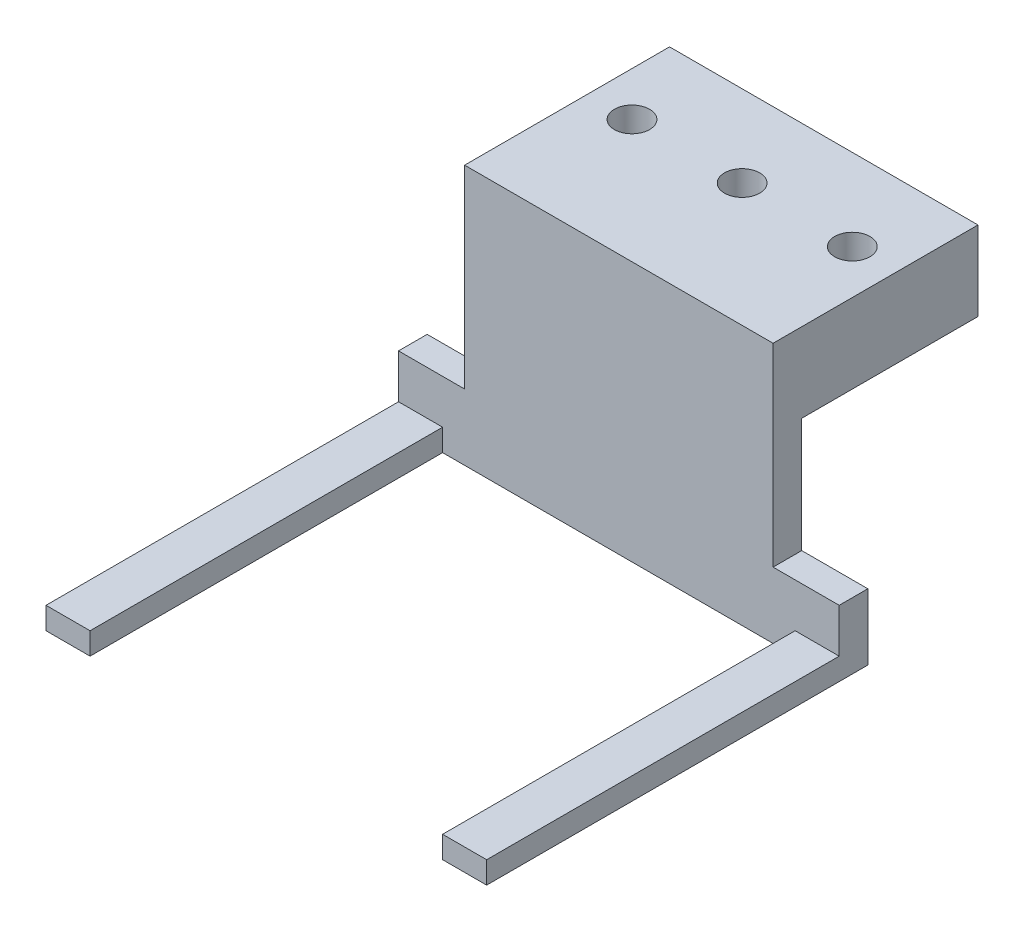
ISO-10303-21;
HEADER;
FILE_DESCRIPTION(('STEP AP214'),'2;1');
FILE_NAME('part.step','',(''),(''),'','','');
FILE_SCHEMA(('AUTOMOTIVE_DESIGN { 1 0 10303 214 1 1 1 1 }'));
ENDSEC;
DATA;
#1=APPLICATION_CONTEXT('core data for automotive mechanical design processes');
#2=APPLICATION_PROTOCOL_DEFINITION('international standard','automotive_design',2000,#1);
#3=PRODUCT_CONTEXT('',#1,'mechanical');
#4=PRODUCT('Part','Part','',(#3));
#5=PRODUCT_RELATED_PRODUCT_CATEGORY('part','',(#4));
#6=PRODUCT_DEFINITION_FORMATION('','',#4);
#7=PRODUCT_DEFINITION_CONTEXT('part definition',#1,'design');
#8=PRODUCT_DEFINITION('design','',#6,#7);
#9=PRODUCT_DEFINITION_SHAPE('','',#8);
#10=(LENGTH_UNIT() NAMED_UNIT(*) SI_UNIT(.MILLI.,.METRE.));
#11=(NAMED_UNIT(*) PLANE_ANGLE_UNIT() SI_UNIT($,.RADIAN.));
#12=(NAMED_UNIT(*) SI_UNIT($,.STERADIAN.) SOLID_ANGLE_UNIT());
#13=UNCERTAINTY_MEASURE_WITH_UNIT(LENGTH_MEASURE(1.E-05),#10,'distance_accuracy_value','');
#14=(GEOMETRIC_REPRESENTATION_CONTEXT(3) GLOBAL_UNCERTAINTY_ASSIGNED_CONTEXT((#13)) GLOBAL_UNIT_ASSIGNED_CONTEXT((#10,
#11,#12)) REPRESENTATION_CONTEXT('',''));
#15=CARTESIAN_POINT('',(0.,0.,0.));
#16=DIRECTION('',(0.,0.,1.));
#17=DIRECTION('',(1.,0.,0.));
#18=AXIS2_PLACEMENT_3D('',#15,#16,#17);
#19=CARTESIAN_POINT('',(70.,18.,40.));
#20=DIRECTION('',(-1.,0.,0.));
#21=DIRECTION('',(0.,0.,1.));
#22=AXIS2_PLACEMENT_3D('',#19,#20,#21);
#23=PLANE('',#22);
#24=DIRECTION('',(0.,0.,1.));
#25=VECTOR('',#24,1.);
#26=CARTESIAN_POINT('',(70.,-26.,18.7867965644036));
#27=LINE('',#26,#25);
#28=CARTESIAN_POINT('',(70.,-26.,40.));
#29=VERTEX_POINT('',#28);
#30=CARTESIAN_POINT('',(70.,-26.,46.5));
#31=VERTEX_POINT('',#30);
#32=EDGE_CURVE('E213',#29,#31,#27,.T.);
#33=ORIENTED_EDGE('',*,*,#32,.F.);
#34=DIRECTION('',(0.,1.,0.));
#35=VECTOR('',#34,1.);
#36=CARTESIAN_POINT('',(70.,-41.,40.));
#37=LINE('',#36,#35);
#38=CARTESIAN_POINT('',(70.,0.,40.));
#39=VERTEX_POINT('',#38);
#40=EDGE_CURVE('E254',#29,#39,#37,.T.);
#41=ORIENTED_EDGE('',*,*,#40,.T.);
#42=DIRECTION('',(0.,0.,-1.));
#43=VECTOR('',#42,1.);
#44=CARTESIAN_POINT('',(70.,0.,40.));
#45=LINE('',#44,#43);
#46=CARTESIAN_POINT('',(70.,0.,0.));
#47=VERTEX_POINT('',#46);
#48=EDGE_CURVE('E266',#39,#47,#45,.T.);
#49=ORIENTED_EDGE('',*,*,#48,.T.);
#50=DIRECTION('',(0.,-1.,0.));
#51=VECTOR('',#50,1.);
#52=CARTESIAN_POINT('',(70.,18.,0.));
#53=LINE('',#52,#51);
#54=CARTESIAN_POINT('',(70.,18.,0.));
#55=VERTEX_POINT('',#54);
#56=EDGE_CURVE('E47',#55,#47,#53,.T.);
#57=ORIENTED_EDGE('',*,*,#56,.F.);
#58=DIRECTION('',(0.,0.,-1.));
#59=VECTOR('',#58,1.);
#60=CARTESIAN_POINT('',(70.,18.,40.));
#61=LINE('',#60,#59);
#62=CARTESIAN_POINT('',(70.,18.,46.5));
#63=VERTEX_POINT('',#62);
#64=EDGE_CURVE('E269',#63,#55,#61,.T.);
#65=ORIENTED_EDGE('',*,*,#64,.F.);
#66=DIRECTION('',(0.,1.,0.));
#67=VECTOR('',#66,1.);
#68=CARTESIAN_POINT('',(70.,-41.,46.5));
#69=LINE('',#68,#67);
#70=EDGE_CURVE('E257',#31,#63,#69,.T.);
#71=ORIENTED_EDGE('',*,*,#70,.F.);
#72=EDGE_LOOP('',(#33,#41,#49,#57,#65,#71));
#73=FACE_BOUND('',#72,.T.);
#74=ADVANCED_FACE('F39',(#73),#23,.F.);
#75=CARTESIAN_POINT('',(70.,18.,0.));
#76=DIRECTION('',(0.,0.,1.));
#77=DIRECTION('',(1.,0.,0.));
#78=AXIS2_PLACEMENT_3D('',#75,#76,#77);
#79=PLANE('',#78);
#80=DIRECTION('',(-1.,0.,0.));
#81=VECTOR('',#80,1.);
#82=CARTESIAN_POINT('',(70.,0.,0.));
#83=LINE('',#82,#81);
#84=CARTESIAN_POINT('',(0.,0.,0.));
#85=VERTEX_POINT('',#84);
#86=EDGE_CURVE('E256',#47,#85,#83,.T.);
#87=ORIENTED_EDGE('',*,*,#86,.T.);
#88=DIRECTION('',(0.,-1.,0.));
#89=VECTOR('',#88,1.);
#90=CARTESIAN_POINT('',(0.,18.,0.));
#91=LINE('',#90,#89);
#92=CARTESIAN_POINT('',(0.,18.,0.));
#93=VERTEX_POINT('',#92);
#94=EDGE_CURVE('E11',#93,#85,#91,.T.);
#95=ORIENTED_EDGE('',*,*,#94,.F.);
#96=DIRECTION('',(-1.,0.,0.));
#97=VECTOR('',#96,1.);
#98=CARTESIAN_POINT('',(70.,18.,0.));
#99=LINE('',#98,#97);
#100=EDGE_CURVE('E262',#55,#93,#99,.T.);
#101=ORIENTED_EDGE('',*,*,#100,.F.);
#102=ORIENTED_EDGE('',*,*,#56,.T.);
#103=EDGE_LOOP('',(#87,#95,#101,#102));
#104=FACE_BOUND('',#103,.T.);
#105=ADVANCED_FACE('F41',(#104),#79,.F.);
#106=CARTESIAN_POINT('',(0.,18.,0.));
#107=DIRECTION('',(1.,0.,0.));
#108=DIRECTION('',(0.,0.,-1.));
#109=AXIS2_PLACEMENT_3D('',#106,#107,#108);
#110=PLANE('',#109);
#111=DIRECTION('',(0.,1.,0.));
#112=VECTOR('',#111,1.);
#113=CARTESIAN_POINT('',(0.,-41.,40.));
#114=LINE('',#113,#112);
#115=CARTESIAN_POINT('',(0.,-26.,40.));
#116=VERTEX_POINT('',#115);
#117=CARTESIAN_POINT('',(0.,0.,40.));
#118=VERTEX_POINT('',#117);
#119=EDGE_CURVE('E251',#116,#118,#114,.T.);
#120=ORIENTED_EDGE('',*,*,#119,.F.);
#121=DIRECTION('',(0.,0.,1.));
#122=VECTOR('',#121,1.);
#123=CARTESIAN_POINT('',(0.,-26.,18.7867965644036));
#124=LINE('',#123,#122);
#125=CARTESIAN_POINT('',(0.,-26.,46.5));
#126=VERTEX_POINT('',#125);
#127=EDGE_CURVE('E242',#116,#126,#124,.T.);
#128=ORIENTED_EDGE('',*,*,#127,.T.);
#129=DIRECTION('',(0.,1.,0.));
#130=VECTOR('',#129,1.);
#131=CARTESIAN_POINT('',(0.,-41.,46.5));
#132=LINE('',#131,#130);
#133=CARTESIAN_POINT('',(0.,18.,46.5));
#134=VERTEX_POINT('',#133);
#135=EDGE_CURVE('E259',#126,#134,#132,.T.);
#136=ORIENTED_EDGE('',*,*,#135,.T.);
#137=DIRECTION('',(0.,0.,1.));
#138=VECTOR('',#137,1.);
#139=CARTESIAN_POINT('',(0.,18.,0.));
#140=LINE('',#139,#138);
#141=EDGE_CURVE('E265',#93,#134,#140,.T.);
#142=ORIENTED_EDGE('',*,*,#141,.F.);
#143=ORIENTED_EDGE('',*,*,#94,.T.);
#144=DIRECTION('',(0.,0.,1.));
#145=VECTOR('',#144,1.);
#146=CARTESIAN_POINT('',(0.,0.,0.));
#147=LINE('',#146,#145);
#148=EDGE_CURVE('E273',#85,#118,#147,.T.);
#149=ORIENTED_EDGE('',*,*,#148,.T.);
#150=EDGE_LOOP('',(#120,#128,#136,#142,#143,#149));
#151=FACE_BOUND('',#150,.T.);
#152=ADVANCED_FACE('F293',(#151),#110,.F.);
#153=CARTESIAN_POINT('',(0.,18.,0.));
#154=DIRECTION('',(0.,1.,0.));
#155=DIRECTION('',(0.,0.,1.));
#156=AXIS2_PLACEMENT_3D('',#153,#154,#155);
#157=PLANE('',#156);
#158=CARTESIAN_POINT('',(10.,18.,18.523));
#159=DIRECTION('',(0.,1.,0.));
#160=DIRECTION('',(0.,0.,-1.));
#161=AXIS2_PLACEMENT_3D('',#158,#159,#160);
#162=CIRCLE('',#161,4.00000000000001);
#163=CARTESIAN_POINT('',(10.,18.,14.523));
#164=VERTEX_POINT('',#163);
#165=EDGE_CURVE('E594',#164,#164,#162,.T.);
#166=ORIENTED_EDGE('',*,*,#165,.F.);
#167=EDGE_LOOP('',(#166));
#168=FACE_BOUND('',#167,.T.);
#169=CARTESIAN_POINT('',(60.,18.,18.523));
#170=DIRECTION('',(0.,1.,0.));
#171=DIRECTION('',(0.,0.,1.));
#172=AXIS2_PLACEMENT_3D('',#169,#170,#171);
#173=CIRCLE('',#172,4.00000000000001);
#174=CARTESIAN_POINT('',(60.,18.,22.523));
#175=VERTEX_POINT('',#174);
#176=EDGE_CURVE('E598',#175,#175,#173,.T.);
#177=ORIENTED_EDGE('',*,*,#176,.F.);
#178=EDGE_LOOP('',(#177));
#179=FACE_BOUND('',#178,.T.);
#180=CARTESIAN_POINT('',(35.,18.,18.523));
#181=DIRECTION('',(0.,1.,0.));
#182=DIRECTION('',(0.,0.,1.));
#183=AXIS2_PLACEMENT_3D('',#180,#181,#182);
#184=CIRCLE('',#183,4.00000000000001);
#185=CARTESIAN_POINT('',(35.,18.,22.523));
#186=VERTEX_POINT('',#185);
#187=EDGE_CURVE('E603',#186,#186,#184,.T.);
#188=ORIENTED_EDGE('',*,*,#187,.F.);
#189=EDGE_LOOP('',(#188));
#190=FACE_BOUND('',#189,.T.);
#191=ORIENTED_EDGE('',*,*,#100,.T.);
#192=ORIENTED_EDGE('',*,*,#141,.T.);
#193=DIRECTION('',(1.,0.,0.));
#194=VECTOR('',#193,1.);
#195=CARTESIAN_POINT('',(0.,18.,46.5));
#196=LINE('',#195,#194);
#197=EDGE_CURVE('E246',#134,#63,#196,.T.);
#198=ORIENTED_EDGE('',*,*,#197,.T.);
#199=ORIENTED_EDGE('',*,*,#64,.T.);
#200=EDGE_LOOP('',(#191,#192,#198,#199));
#201=FACE_BOUND('',#200,.T.);
#202=ADVANCED_FACE('F297',(#168,#179,#190,#201),#157,.T.);
#203=CARTESIAN_POINT('',(0.,0.,0.));
#204=DIRECTION('',(0.,1.,0.));
#205=DIRECTION('',(0.,0.,1.));
#206=AXIS2_PLACEMENT_3D('',#203,#204,#205);
#207=PLANE('',#206);
#208=CARTESIAN_POINT('',(10.,0.,18.523));
#209=DIRECTION('',(0.,1.,0.));
#210=DIRECTION('',(0.,0.,1.));
#211=AXIS2_PLACEMENT_3D('',#208,#209,#210);
#212=CIRCLE('',#211,4.00000000000001);
#213=CARTESIAN_POINT('',(10.,0.,22.523));
#214=VERTEX_POINT('',#213);
#215=EDGE_CURVE('E592',#214,#214,#212,.F.);
#216=ORIENTED_EDGE('',*,*,#215,.F.);
#217=EDGE_LOOP('',(#216));
#218=FACE_BOUND('',#217,.T.);
#219=CARTESIAN_POINT('',(60.,0.,18.523));
#220=DIRECTION('',(0.,1.,0.));
#221=DIRECTION('',(0.,0.,1.));
#222=AXIS2_PLACEMENT_3D('',#219,#220,#221);
#223=CIRCLE('',#222,4.00000000000001);
#224=CARTESIAN_POINT('',(60.,0.,22.523));
#225=VERTEX_POINT('',#224);
#226=EDGE_CURVE('E595',#225,#225,#223,.F.);
#227=ORIENTED_EDGE('',*,*,#226,.F.);
#228=EDGE_LOOP('',(#227));
#229=FACE_BOUND('',#228,.T.);
#230=CARTESIAN_POINT('',(35.,0.,18.523));
#231=DIRECTION('',(0.,1.,0.));
#232=DIRECTION('',(0.,0.,1.));
#233=AXIS2_PLACEMENT_3D('',#230,#231,#232);
#234=CIRCLE('',#233,4.00000000000001);
#235=CARTESIAN_POINT('',(35.,0.,22.523));
#236=VERTEX_POINT('',#235);
#237=EDGE_CURVE('E187',#236,#236,#234,.F.);
#238=ORIENTED_EDGE('',*,*,#237,.F.);
#239=EDGE_LOOP('',(#238));
#240=FACE_BOUND('',#239,.T.);
#241=ORIENTED_EDGE('',*,*,#86,.F.);
#242=ORIENTED_EDGE('',*,*,#48,.F.);
#243=DIRECTION('',(1.,0.,0.));
#244=VECTOR('',#243,1.);
#245=CARTESIAN_POINT('',(0.,0.,40.));
#246=LINE('',#245,#244);
#247=EDGE_CURVE('E276',#118,#39,#246,.T.);
#248=ORIENTED_EDGE('',*,*,#247,.F.);
#249=ORIENTED_EDGE('',*,*,#148,.F.);
#250=EDGE_LOOP('',(#241,#242,#248,#249));
#251=FACE_BOUND('',#250,.T.);
#252=ADVANCED_FACE('F289',(#218,#229,#240,#251),#207,.F.);
#253=CARTESIAN_POINT('',(0.,-41.,40.));
#254=DIRECTION('',(0.,0.,-1.));
#255=DIRECTION('',(-1.,0.,0.));
#256=AXIS2_PLACEMENT_3D('',#253,#254,#255);
#257=PLANE('',#256);
#258=DIRECTION('',(-1.,0.,0.));
#259=VECTOR('',#258,1.);
#260=CARTESIAN_POINT('',(0.,-41.,40.));
#261=LINE('',#260,#259);
#262=CARTESIAN_POINT('',(85.,-41.,40.));
#263=VERTEX_POINT('',#262);
#264=CARTESIAN_POINT('',(-15.,-41.,40.));
#265=VERTEX_POINT('',#264);
#266=EDGE_CURVE('E247',#263,#265,#261,.T.);
#267=ORIENTED_EDGE('',*,*,#266,.T.);
#268=DIRECTION('',(0.,-1.,0.));
#269=VECTOR('',#268,1.);
#270=CARTESIAN_POINT('',(-15.,-41.,40.));
#271=LINE('',#270,#269);
#272=CARTESIAN_POINT('',(-15.,-26.,40.));
#273=VERTEX_POINT('',#272);
#274=EDGE_CURVE('E237',#273,#265,#271,.T.);
#275=ORIENTED_EDGE('',*,*,#274,.F.);
#276=DIRECTION('',(-1.,0.,0.));
#277=VECTOR('',#276,1.);
#278=CARTESIAN_POINT('',(-15.,-26.,40.));
#279=LINE('',#278,#277);
#280=EDGE_CURVE('E232',#116,#273,#279,.T.);
#281=ORIENTED_EDGE('',*,*,#280,.F.);
#282=ORIENTED_EDGE('',*,*,#119,.T.);
#283=ORIENTED_EDGE('',*,*,#247,.T.);
#284=ORIENTED_EDGE('',*,*,#40,.F.);
#285=DIRECTION('',(1.,0.,0.));
#286=VECTOR('',#285,1.);
#287=CARTESIAN_POINT('',(85.,-26.,40.));
#288=LINE('',#287,#286);
#289=CARTESIAN_POINT('',(85.,-26.,40.));
#290=VERTEX_POINT('',#289);
#291=EDGE_CURVE('E224',#29,#290,#288,.T.);
#292=ORIENTED_EDGE('',*,*,#291,.T.);
#293=DIRECTION('',(0.,-1.,0.));
#294=VECTOR('',#293,1.);
#295=CARTESIAN_POINT('',(85.,-41.,40.));
#296=LINE('',#295,#294);
#297=EDGE_CURVE('E220',#290,#263,#296,.T.);
#298=ORIENTED_EDGE('',*,*,#297,.T.);
#299=EDGE_LOOP('',(#267,#275,#281,#282,#283,#284,#292,#298));
#300=FACE_BOUND('',#299,.T.);
#301=ADVANCED_FACE('F312',(#300),#257,.T.);
#302=CARTESIAN_POINT('',(0.,-41.,46.5));
#303=DIRECTION('',(0.,0.,1.));
#304=DIRECTION('',(1.,0.,0.));
#305=AXIS2_PLACEMENT_3D('',#302,#303,#304);
#306=PLANE('',#305);
#307=DIRECTION('',(1.,0.,0.));
#308=VECTOR('',#307,1.);
#309=CARTESIAN_POINT('',(85.,-36.,46.5));
#310=LINE('',#309,#308);
#311=CARTESIAN_POINT('',(75.,-36.,46.5));
#312=VERTEX_POINT('',#311);
#313=CARTESIAN_POINT('',(85.,-36.,46.5));
#314=VERTEX_POINT('',#313);
#315=EDGE_CURVE('E185',#312,#314,#310,.T.);
#316=ORIENTED_EDGE('',*,*,#315,.T.);
#317=DIRECTION('',(0.,-1.,0.));
#318=VECTOR('',#317,1.);
#319=CARTESIAN_POINT('',(85.,-41.,46.5));
#320=LINE('',#319,#318);
#321=CARTESIAN_POINT('',(85.,-26.,46.5));
#322=VERTEX_POINT('',#321);
#323=EDGE_CURVE('E160',#322,#314,#320,.T.);
#324=ORIENTED_EDGE('',*,*,#323,.F.);
#325=DIRECTION('',(1.,0.,0.));
#326=VECTOR('',#325,1.);
#327=CARTESIAN_POINT('',(85.,-26.,46.5));
#328=LINE('',#327,#326);
#329=EDGE_CURVE('E214',#31,#322,#328,.T.);
#330=ORIENTED_EDGE('',*,*,#329,.F.);
#331=ORIENTED_EDGE('',*,*,#70,.T.);
#332=ORIENTED_EDGE('',*,*,#197,.F.);
#333=ORIENTED_EDGE('',*,*,#135,.F.);
#334=DIRECTION('',(-1.,0.,0.));
#335=VECTOR('',#334,1.);
#336=CARTESIAN_POINT('',(-15.,-26.,46.5));
#337=LINE('',#336,#335);
#338=CARTESIAN_POINT('',(-15.,-26.,46.5));
#339=VERTEX_POINT('',#338);
#340=EDGE_CURVE('E223',#126,#339,#337,.T.);
#341=ORIENTED_EDGE('',*,*,#340,.T.);
#342=DIRECTION('',(0.,-1.,0.));
#343=VECTOR('',#342,1.);
#344=CARTESIAN_POINT('',(-15.,-41.,46.5));
#345=LINE('',#344,#343);
#346=CARTESIAN_POINT('',(-15.,-36.,46.5));
#347=VERTEX_POINT('',#346);
#348=EDGE_CURVE('E60',#339,#347,#345,.T.);
#349=ORIENTED_EDGE('',*,*,#348,.T.);
#350=DIRECTION('',(-1.,0.,0.));
#351=VECTOR('',#350,1.);
#352=CARTESIAN_POINT('',(-15.,-36.,46.5));
#353=LINE('',#352,#351);
#354=CARTESIAN_POINT('',(-5.,-36.,46.5));
#355=VERTEX_POINT('',#354);
#356=EDGE_CURVE('E196',#355,#347,#353,.T.);
#357=ORIENTED_EDGE('',*,*,#356,.F.);
#358=DIRECTION('',(0.,1.,0.));
#359=VECTOR('',#358,1.);
#360=CARTESIAN_POINT('',(-5.,-36.,46.5));
#361=LINE('',#360,#359);
#362=CARTESIAN_POINT('',(-5.,-41.,46.5));
#363=VERTEX_POINT('',#362);
#364=EDGE_CURVE('E54',#363,#355,#361,.T.);
#365=ORIENTED_EDGE('',*,*,#364,.F.);
#366=DIRECTION('',(1.,0.,0.));
#367=VECTOR('',#366,1.);
#368=CARTESIAN_POINT('',(0.,-41.,46.5));
#369=LINE('',#368,#367);
#370=CARTESIAN_POINT('',(75.,-41.,46.5));
#371=VERTEX_POINT('',#370);
#372=EDGE_CURVE('E249',#363,#371,#369,.T.);
#373=ORIENTED_EDGE('',*,*,#372,.T.);
#374=DIRECTION('',(0.,1.,0.));
#375=VECTOR('',#374,1.);
#376=CARTESIAN_POINT('',(75.,-36.,46.5));
#377=LINE('',#376,#375);
#378=EDGE_CURVE('E175',#371,#312,#377,.T.);
#379=ORIENTED_EDGE('',*,*,#378,.T.);
#380=EDGE_LOOP('',(#316,#324,#330,#331,#332,#333,#341,#349,#357,#365,#373,#379));
#381=FACE_BOUND('',#380,.T.);
#382=ADVANCED_FACE('F304',(#381),#306,.T.);
#383=CARTESIAN_POINT('',(0.,-41.,0.));
#384=DIRECTION('',(0.,1.,0.));
#385=DIRECTION('',(0.,0.,1.));
#386=AXIS2_PLACEMENT_3D('',#383,#384,#385);
#387=PLANE('',#386);
#388=ORIENTED_EDGE('',*,*,#266,.F.);
#389=DIRECTION('',(0.,0.,1.));
#390=VECTOR('',#389,1.);
#391=CARTESIAN_POINT('',(85.,-41.,18.7867965644036));
#392=LINE('',#391,#390);
#393=CARTESIAN_POINT('',(85.,-41.,126.5));
#394=VERTEX_POINT('',#393);
#395=EDGE_CURVE('E219',#263,#394,#392,.T.);
#396=ORIENTED_EDGE('',*,*,#395,.T.);
#397=DIRECTION('',(-1.,0.,0.));
#398=VECTOR('',#397,1.);
#399=CARTESIAN_POINT('',(75.,-41.,126.5));
#400=LINE('',#399,#398);
#401=CARTESIAN_POINT('',(75.,-41.,126.5));
#402=VERTEX_POINT('',#401);
#403=EDGE_CURVE('E174',#394,#402,#400,.T.);
#404=ORIENTED_EDGE('',*,*,#403,.T.);
#405=DIRECTION('',(0.,0.,-1.));
#406=VECTOR('',#405,1.);
#407=CARTESIAN_POINT('',(75.,-41.,126.5));
#408=LINE('',#407,#406);
#409=EDGE_CURVE('E184',#402,#371,#408,.T.);
#410=ORIENTED_EDGE('',*,*,#409,.T.);
#411=ORIENTED_EDGE('',*,*,#372,.F.);
#412=DIRECTION('',(0.,0.,-1.));
#413=VECTOR('',#412,1.);
#414=CARTESIAN_POINT('',(-5.,-41.,126.5));
#415=LINE('',#414,#413);
#416=CARTESIAN_POINT('',(-5.,-41.,126.5));
#417=VERTEX_POINT('',#416);
#418=EDGE_CURVE('E210',#417,#363,#415,.T.);
#419=ORIENTED_EDGE('',*,*,#418,.F.);
#420=DIRECTION('',(1.,0.,0.));
#421=VECTOR('',#420,1.);
#422=CARTESIAN_POINT('',(-5.,-41.,126.5));
#423=LINE('',#422,#421);
#424=CARTESIAN_POINT('',(-15.,-41.,126.5));
#425=VERTEX_POINT('',#424);
#426=EDGE_CURVE('E195',#425,#417,#423,.T.);
#427=ORIENTED_EDGE('',*,*,#426,.F.);
#428=DIRECTION('',(0.,0.,1.));
#429=VECTOR('',#428,1.);
#430=CARTESIAN_POINT('',(-15.,-41.,18.7867965644036));
#431=LINE('',#430,#429);
#432=EDGE_CURVE('E240',#265,#425,#431,.T.);
#433=ORIENTED_EDGE('',*,*,#432,.F.);
#434=EDGE_LOOP('',(#388,#396,#404,#410,#411,#419,#427,#433));
#435=FACE_BOUND('',#434,.T.);
#436=ADVANCED_FACE('F309',(#435),#387,.F.);
#437=CARTESIAN_POINT('',(-15.,-26.,18.7867965644036));
#438=DIRECTION('',(0.,1.,0.));
#439=DIRECTION('',(0.,0.,1.));
#440=AXIS2_PLACEMENT_3D('',#437,#438,#439);
#441=PLANE('',#440);
#442=ORIENTED_EDGE('',*,*,#127,.F.);
#443=ORIENTED_EDGE('',*,*,#280,.T.);
#444=DIRECTION('',(0.,0.,1.));
#445=VECTOR('',#444,1.);
#446=CARTESIAN_POINT('',(-15.,-26.,18.7867965644036));
#447=LINE('',#446,#445);
#448=EDGE_CURVE('E236',#273,#339,#447,.T.);
#449=ORIENTED_EDGE('',*,*,#448,.T.);
#450=ORIENTED_EDGE('',*,*,#340,.F.);
#451=EDGE_LOOP('',(#442,#443,#449,#450));
#452=FACE_BOUND('',#451,.T.);
#453=ADVANCED_FACE('F315',(#452),#441,.T.);
#454=CARTESIAN_POINT('',(-15.,-41.,18.7867965644036));
#455=DIRECTION('',(-1.,0.,0.));
#456=DIRECTION('',(0.,0.,1.));
#457=AXIS2_PLACEMENT_3D('',#454,#455,#456);
#458=PLANE('',#457);
#459=ORIENTED_EDGE('',*,*,#448,.F.);
#460=ORIENTED_EDGE('',*,*,#274,.T.);
#461=ORIENTED_EDGE('',*,*,#432,.T.);
#462=DIRECTION('',(0.,-1.,0.));
#463=VECTOR('',#462,1.);
#464=CARTESIAN_POINT('',(-15.,-41.,126.5));
#465=LINE('',#464,#463);
#466=CARTESIAN_POINT('',(-15.,-36.,126.5));
#467=VERTEX_POINT('',#466);
#468=EDGE_CURVE('E192',#467,#425,#465,.T.);
#469=ORIENTED_EDGE('',*,*,#468,.F.);
#470=DIRECTION('',(0.,0.,-1.));
#471=VECTOR('',#470,1.);
#472=CARTESIAN_POINT('',(-15.,-36.,126.5));
#473=LINE('',#472,#471);
#474=EDGE_CURVE('E202',#467,#347,#473,.T.);
#475=ORIENTED_EDGE('',*,*,#474,.T.);
#476=ORIENTED_EDGE('',*,*,#348,.F.);
#477=EDGE_LOOP('',(#459,#460,#461,#469,#475,#476));
#478=FACE_BOUND('',#477,.T.);
#479=ADVANCED_FACE('F318',(#478),#458,.T.);
#480=CARTESIAN_POINT('',(85.,-26.,18.7867965644036));
#481=DIRECTION('',(0.,-1.,0.));
#482=DIRECTION('',(0.,0.,-1.));
#483=AXIS2_PLACEMENT_3D('',#480,#481,#482);
#484=PLANE('',#483);
#485=ORIENTED_EDGE('',*,*,#291,.F.);
#486=ORIENTED_EDGE('',*,*,#32,.T.);
#487=ORIENTED_EDGE('',*,*,#329,.T.);
#488=DIRECTION('',(0.,0.,1.));
#489=VECTOR('',#488,1.);
#490=CARTESIAN_POINT('',(85.,-26.,18.7867965644036));
#491=LINE('',#490,#489);
#492=EDGE_CURVE('E217',#290,#322,#491,.T.);
#493=ORIENTED_EDGE('',*,*,#492,.F.);
#494=EDGE_LOOP('',(#485,#486,#487,#493));
#495=FACE_BOUND('',#494,.T.);
#496=ADVANCED_FACE('F302',(#495),#484,.F.);
#497=CARTESIAN_POINT('',(85.,-41.,18.7867965644036));
#498=DIRECTION('',(-1.,0.,0.));
#499=DIRECTION('',(0.,0.,1.));
#500=AXIS2_PLACEMENT_3D('',#497,#498,#499);
#501=PLANE('',#500);
#502=ORIENTED_EDGE('',*,*,#297,.F.);
#503=ORIENTED_EDGE('',*,*,#492,.T.);
#504=ORIENTED_EDGE('',*,*,#323,.T.);
#505=DIRECTION('',(0.,0.,-1.));
#506=VECTOR('',#505,1.);
#507=CARTESIAN_POINT('',(85.,-36.,126.5));
#508=LINE('',#507,#506);
#509=CARTESIAN_POINT('',(85.,-36.,126.5));
#510=VERTEX_POINT('',#509);
#511=EDGE_CURVE('E153',#510,#314,#508,.T.);
#512=ORIENTED_EDGE('',*,*,#511,.F.);
#513=DIRECTION('',(0.,-1.,0.));
#514=VECTOR('',#513,1.);
#515=CARTESIAN_POINT('',(85.,-41.,126.5));
#516=LINE('',#515,#514);
#517=EDGE_CURVE('E157',#510,#394,#516,.T.);
#518=ORIENTED_EDGE('',*,*,#517,.T.);
#519=ORIENTED_EDGE('',*,*,#395,.F.);
#520=EDGE_LOOP('',(#502,#503,#504,#512,#518,#519));
#521=FACE_BOUND('',#520,.T.);
#522=ADVANCED_FACE('F155',(#521),#501,.F.);
#523=CARTESIAN_POINT('',(-5.,-36.,126.5));
#524=DIRECTION('',(-1.,0.,0.));
#525=DIRECTION('',(0.,-1.,0.));
#526=AXIS2_PLACEMENT_3D('',#523,#524,#525);
#527=PLANE('',#526);
#528=ORIENTED_EDGE('',*,*,#364,.T.);
#529=DIRECTION('',(0.,0.,-1.));
#530=VECTOR('',#529,1.);
#531=CARTESIAN_POINT('',(-5.,-36.,126.5));
#532=LINE('',#531,#530);
#533=CARTESIAN_POINT('',(-5.,-36.,126.5));
#534=VERTEX_POINT('',#533);
#535=EDGE_CURVE('E207',#534,#355,#532,.T.);
#536=ORIENTED_EDGE('',*,*,#535,.F.);
#537=DIRECTION('',(0.,1.,0.));
#538=VECTOR('',#537,1.);
#539=CARTESIAN_POINT('',(-5.,-36.,126.5));
#540=LINE('',#539,#538);
#541=EDGE_CURVE('E198',#417,#534,#540,.T.);
#542=ORIENTED_EDGE('',*,*,#541,.F.);
#543=ORIENTED_EDGE('',*,*,#418,.T.);
#544=EDGE_LOOP('',(#528,#536,#542,#543));
#545=FACE_BOUND('',#544,.T.);
#546=ADVANCED_FACE('F326',(#545),#527,.F.);
#547=CARTESIAN_POINT('',(-15.,-36.,126.5));
#548=DIRECTION('',(0.,-1.,0.));
#549=DIRECTION('',(0.,0.,-1.));
#550=AXIS2_PLACEMENT_3D('',#547,#548,#549);
#551=PLANE('',#550);
#552=ORIENTED_EDGE('',*,*,#356,.T.);
#553=ORIENTED_EDGE('',*,*,#474,.F.);
#554=DIRECTION('',(-1.,0.,0.));
#555=VECTOR('',#554,1.);
#556=CARTESIAN_POINT('',(-15.,-36.,126.5));
#557=LINE('',#556,#555);
#558=EDGE_CURVE('E200',#534,#467,#557,.T.);
#559=ORIENTED_EDGE('',*,*,#558,.F.);
#560=ORIENTED_EDGE('',*,*,#535,.T.);
#561=EDGE_LOOP('',(#552,#553,#559,#560));
#562=FACE_BOUND('',#561,.T.);
#563=ADVANCED_FACE('F323',(#562),#551,.F.);
#564=CARTESIAN_POINT('',(0.,0.,126.5));
#565=DIRECTION('',(0.,0.,-1.));
#566=DIRECTION('',(-1.,0.,0.));
#567=AXIS2_PLACEMENT_3D('',#564,#565,#566);
#568=PLANE('',#567);
#569=ORIENTED_EDGE('',*,*,#468,.T.);
#570=ORIENTED_EDGE('',*,*,#426,.T.);
#571=ORIENTED_EDGE('',*,*,#541,.T.);
#572=ORIENTED_EDGE('',*,*,#558,.T.);
#573=EDGE_LOOP('',(#569,#570,#571,#572));
#574=FACE_BOUND('',#573,.T.);
#575=ADVANCED_FACE('F331',(#574),#568,.F.);
#576=CARTESIAN_POINT('',(85.,-36.,126.5));
#577=DIRECTION('',(0.,1.,0.));
#578=DIRECTION('',(0.,0.,1.));
#579=AXIS2_PLACEMENT_3D('',#576,#577,#578);
#580=PLANE('',#579);
#581=ORIENTED_EDGE('',*,*,#315,.F.);
#582=DIRECTION('',(0.,0.,-1.));
#583=VECTOR('',#582,1.);
#584=CARTESIAN_POINT('',(75.,-36.,126.5));
#585=LINE('',#584,#583);
#586=CARTESIAN_POINT('',(75.,-36.,126.5));
#587=VERTEX_POINT('',#586);
#588=EDGE_CURVE('E165',#587,#312,#585,.T.);
#589=ORIENTED_EDGE('',*,*,#588,.F.);
#590=DIRECTION('',(1.,0.,0.));
#591=VECTOR('',#590,1.);
#592=CARTESIAN_POINT('',(85.,-36.,126.5));
#593=LINE('',#592,#591);
#594=EDGE_CURVE('E171',#587,#510,#593,.T.);
#595=ORIENTED_EDGE('',*,*,#594,.T.);
#596=ORIENTED_EDGE('',*,*,#511,.T.);
#597=EDGE_LOOP('',(#581,#589,#595,#596));
#598=FACE_BOUND('',#597,.T.);
#599=ADVANCED_FACE('F177',(#598),#580,.T.);
#600=CARTESIAN_POINT('',(75.,-36.,126.5));
#601=DIRECTION('',(-1.,0.,0.));
#602=DIRECTION('',(0.,-1.,0.));
#603=AXIS2_PLACEMENT_3D('',#600,#601,#602);
#604=PLANE('',#603);
#605=ORIENTED_EDGE('',*,*,#378,.F.);
#606=ORIENTED_EDGE('',*,*,#409,.F.);
#607=DIRECTION('',(0.,1.,0.));
#608=VECTOR('',#607,1.);
#609=CARTESIAN_POINT('',(75.,-36.,126.5));
#610=LINE('',#609,#608);
#611=EDGE_CURVE('E178',#402,#587,#610,.T.);
#612=ORIENTED_EDGE('',*,*,#611,.T.);
#613=ORIENTED_EDGE('',*,*,#588,.T.);
#614=EDGE_LOOP('',(#605,#606,#612,#613));
#615=FACE_BOUND('',#614,.T.);
#616=ADVANCED_FACE('F307',(#615),#604,.T.);
#617=CARTESIAN_POINT('',(70.,0.,126.5));
#618=DIRECTION('',(0.,0.,-1.));
#619=DIRECTION('',(1.,0.,0.));
#620=AXIS2_PLACEMENT_3D('',#617,#618,#619);
#621=PLANE('',#620);
#622=ORIENTED_EDGE('',*,*,#517,.F.);
#623=ORIENTED_EDGE('',*,*,#594,.F.);
#624=ORIENTED_EDGE('',*,*,#611,.F.);
#625=ORIENTED_EDGE('',*,*,#403,.F.);
#626=EDGE_LOOP('',(#622,#623,#624,#625));
#627=FACE_BOUND('',#626,.T.);
#628=ADVANCED_FACE('F169',(#627),#621,.F.);
#629=CARTESIAN_POINT('',(35.,-11.3137084989848,18.523));
#630=DIRECTION('',(0.,1.,0.));
#631=DIRECTION('',(0.,0.,1.));
#632=AXIS2_PLACEMENT_3D('',#629,#630,#631);
#633=CYLINDRICAL_SURFACE('',#632,4.00000000000001);
#634=ORIENTED_EDGE('',*,*,#237,.T.);
#635=EDGE_LOOP('',(#634));
#636=FACE_BOUND('',#635,.T.);
#637=ORIENTED_EDGE('',*,*,#187,.T.);
#638=EDGE_LOOP('',(#637));
#639=FACE_BOUND('',#638,.T.);
#640=ADVANCED_FACE('F434',(#636,#639),#633,.F.);
#641=CARTESIAN_POINT('',(60.,-11.3137084989848,18.523));
#642=DIRECTION('',(0.,1.,0.));
#643=DIRECTION('',(0.,0.,1.));
#644=AXIS2_PLACEMENT_3D('',#641,#642,#643);
#645=CYLINDRICAL_SURFACE('',#644,4.00000000000001);
#646=ORIENTED_EDGE('',*,*,#226,.T.);
#647=EDGE_LOOP('',(#646));
#648=FACE_BOUND('',#647,.T.);
#649=ORIENTED_EDGE('',*,*,#176,.T.);
#650=EDGE_LOOP('',(#649));
#651=FACE_BOUND('',#650,.T.);
#652=ADVANCED_FACE('F459',(#648,#651),#645,.F.);
#653=CARTESIAN_POINT('',(10.,-11.3137084989848,18.523));
#654=DIRECTION('',(0.,1.,0.));
#655=DIRECTION('',(0.,0.,1.));
#656=AXIS2_PLACEMENT_3D('',#653,#654,#655);
#657=CYLINDRICAL_SURFACE('',#656,4.00000000000001);
#658=ORIENTED_EDGE('',*,*,#215,.T.);
#659=EDGE_LOOP('',(#658));
#660=FACE_BOUND('',#659,.T.);
#661=ORIENTED_EDGE('',*,*,#165,.T.);
#662=EDGE_LOOP('',(#661));
#663=FACE_BOUND('',#662,.T.);
#664=ADVANCED_FACE('F470',(#660,#663),#657,.F.);
#665=CLOSED_SHELL('',(#74,#105,#152,#202,#252,#301,#382,#436,#453,#479,#496,#522,#546,#563,#575,
#599,#616,#628,#640,#652,#664));
#666=MANIFOLD_SOLID_BREP('B2',#665);
#667=ADVANCED_BREP_SHAPE_REPRESENTATION('',(#18,#666),#14);
#668=SHAPE_DEFINITION_REPRESENTATION(#9,#667);
ENDSEC;
END-ISO-10303-21;
